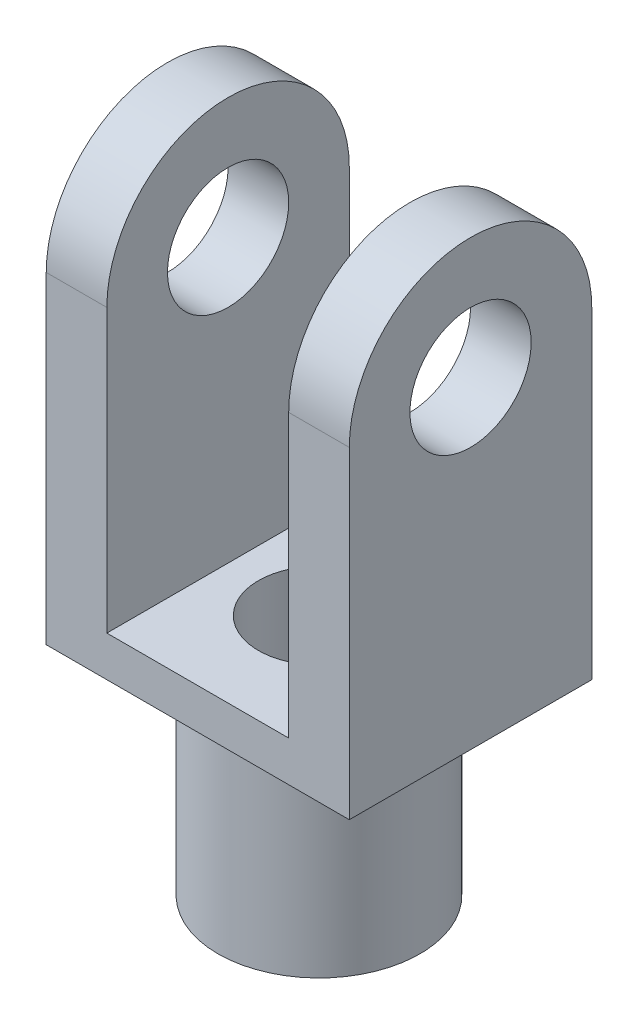
ISO-10303-21;
HEADER;
FILE_DESCRIPTION(('STEP AP214'),'2;1');
FILE_NAME('part.step','',(''),(''),'','','');
FILE_SCHEMA(('AUTOMOTIVE_DESIGN { 1 0 10303 214 1 1 1 1 }'));
ENDSEC;
DATA;
#1=APPLICATION_CONTEXT('core data for automotive mechanical design processes');
#2=APPLICATION_PROTOCOL_DEFINITION('international standard','automotive_design',2000,#1);
#3=PRODUCT_CONTEXT('',#1,'mechanical');
#4=PRODUCT('Part','Part','',(#3));
#5=PRODUCT_RELATED_PRODUCT_CATEGORY('part','',(#4));
#6=PRODUCT_DEFINITION_FORMATION('','',#4);
#7=PRODUCT_DEFINITION_CONTEXT('part definition',#1,'design');
#8=PRODUCT_DEFINITION('design','',#6,#7);
#9=PRODUCT_DEFINITION_SHAPE('','',#8);
#10=(LENGTH_UNIT() NAMED_UNIT(*) SI_UNIT(.MILLI.,.METRE.));
#11=(NAMED_UNIT(*) PLANE_ANGLE_UNIT() SI_UNIT($,.RADIAN.));
#12=(NAMED_UNIT(*) SI_UNIT($,.STERADIAN.) SOLID_ANGLE_UNIT());
#13=UNCERTAINTY_MEASURE_WITH_UNIT(LENGTH_MEASURE(1.E-05),#10,'distance_accuracy_value','');
#14=(GEOMETRIC_REPRESENTATION_CONTEXT(3) GLOBAL_UNCERTAINTY_ASSIGNED_CONTEXT((#13)) GLOBAL_UNIT_ASSIGNED_CONTEXT((#10,
#11,#12)) REPRESENTATION_CONTEXT('',''));
#15=CARTESIAN_POINT('',(0.,0.,0.));
#16=DIRECTION('',(0.,0.,1.));
#17=DIRECTION('',(1.,0.,0.));
#18=AXIS2_PLACEMENT_3D('',#15,#16,#17);
#19=CARTESIAN_POINT('',(7.5,12.,6.));
#20=DIRECTION('',(-1.,0.,0.));
#21=DIRECTION('',(0.,0.,1.));
#22=AXIS2_PLACEMENT_3D('',#19,#20,#21);
#23=PLANE('',#22);
#24=CARTESIAN_POINT('',(7.5,25.9578286914232,0.));
#25=DIRECTION('',(1.,0.,0.));
#26=DIRECTION('',(0.,0.,-1.));
#27=AXIS2_PLACEMENT_3D('',#24,#25,#26);
#28=CIRCLE('',#27,3.);
#29=CARTESIAN_POINT('',(7.5,25.9578286914232,-3.));
#30=VERTEX_POINT('',#29);
#31=EDGE_CURVE('E209',#30,#30,#28,.T.);
#32=ORIENTED_EDGE('',*,*,#31,.F.);
#33=EDGE_LOOP('',(#32));
#34=FACE_BOUND('',#33,.T.);
#35=CARTESIAN_POINT('',(7.5,25.9578286914232,0.));
#36=DIRECTION('',(-1.,0.,0.));
#37=DIRECTION('',(0.,0.,1.));
#38=AXIS2_PLACEMENT_3D('',#35,#36,#37);
#39=CIRCLE('',#38,6.);
#40=CARTESIAN_POINT('',(7.5,25.9578286914232,6.));
#41=VERTEX_POINT('',#40);
#42=CARTESIAN_POINT('',(7.5,25.9578286914232,-6.));
#43=VERTEX_POINT('',#42);
#44=EDGE_CURVE('E110',#41,#43,#39,.T.);
#45=ORIENTED_EDGE('',*,*,#44,.F.);
#46=DIRECTION('',(0.,-1.,0.));
#47=VECTOR('',#46,1.);
#48=CARTESIAN_POINT('',(7.5,12.,6.));
#49=LINE('',#48,#47);
#50=CARTESIAN_POINT('',(7.5,10.,6.));
#51=VERTEX_POINT('',#50);
#52=EDGE_CURVE('E119',#41,#51,#49,.T.);
#53=ORIENTED_EDGE('',*,*,#52,.T.);
#54=DIRECTION('',(0.,0.,-1.));
#55=VECTOR('',#54,1.);
#56=CARTESIAN_POINT('',(7.5,10.,6.));
#57=LINE('',#56,#55);
#58=CARTESIAN_POINT('',(7.5,10.,-6.));
#59=VERTEX_POINT('',#58);
#60=EDGE_CURVE('E242',#51,#59,#57,.T.);
#61=ORIENTED_EDGE('',*,*,#60,.T.);
#62=DIRECTION('',(0.,-1.,0.));
#63=VECTOR('',#62,1.);
#64=CARTESIAN_POINT('',(7.5,12.,-6.));
#65=LINE('',#64,#63);
#66=EDGE_CURVE('E121',#43,#59,#65,.T.);
#67=ORIENTED_EDGE('',*,*,#66,.F.);
#68=EDGE_LOOP('',(#45,#53,#61,#67));
#69=FACE_BOUND('',#68,.T.);
#70=ADVANCED_FACE('F41',(#34,#69),#23,.F.);
#71=CARTESIAN_POINT('',(-7.5,12.,6.));
#72=DIRECTION('',(1.,0.,0.));
#73=DIRECTION('',(0.,0.,-1.));
#74=AXIS2_PLACEMENT_3D('',#71,#72,#73);
#75=PLANE('',#74);
#76=CARTESIAN_POINT('',(-7.5,25.9578286914232,0.));
#77=DIRECTION('',(1.,0.,0.));
#78=DIRECTION('',(0.,0.,-1.));
#79=AXIS2_PLACEMENT_3D('',#76,#77,#78);
#80=CIRCLE('',#79,3.);
#81=CARTESIAN_POINT('',(-7.5,25.9578286914232,-3.));
#82=VERTEX_POINT('',#81);
#83=EDGE_CURVE('E210',#82,#82,#80,.T.);
#84=ORIENTED_EDGE('',*,*,#83,.T.);
#85=EDGE_LOOP('',(#84));
#86=FACE_BOUND('',#85,.T.);
#87=CARTESIAN_POINT('',(-7.5,25.9578286914232,0.));
#88=DIRECTION('',(-1.,0.,0.));
#89=DIRECTION('',(0.,0.,1.));
#90=AXIS2_PLACEMENT_3D('',#87,#88,#89);
#91=CIRCLE('',#90,6.);
#92=CARTESIAN_POINT('',(-7.5,25.9578286914232,6.));
#93=VERTEX_POINT('',#92);
#94=CARTESIAN_POINT('',(-7.5,25.9578286914232,-6.));
#95=VERTEX_POINT('',#94);
#96=EDGE_CURVE('E57',#93,#95,#91,.T.);
#97=ORIENTED_EDGE('',*,*,#96,.T.);
#98=DIRECTION('',(0.,-1.,0.));
#99=VECTOR('',#98,1.);
#100=CARTESIAN_POINT('',(-7.5,12.,-6.));
#101=LINE('',#100,#99);
#102=CARTESIAN_POINT('',(-7.5,10.,-6.));
#103=VERTEX_POINT('',#102);
#104=EDGE_CURVE('E130',#95,#103,#101,.T.);
#105=ORIENTED_EDGE('',*,*,#104,.T.);
#106=DIRECTION('',(0.,0.,1.));
#107=VECTOR('',#106,1.);
#108=CARTESIAN_POINT('',(-7.5,10.,6.));
#109=LINE('',#108,#107);
#110=CARTESIAN_POINT('',(-7.5,10.,6.));
#111=VERTEX_POINT('',#110);
#112=EDGE_CURVE('E250',#103,#111,#109,.T.);
#113=ORIENTED_EDGE('',*,*,#112,.T.);
#114=DIRECTION('',(0.,-1.,0.));
#115=VECTOR('',#114,1.);
#116=CARTESIAN_POINT('',(-7.5,12.,6.));
#117=LINE('',#116,#115);
#118=EDGE_CURVE('E127',#93,#111,#117,.T.);
#119=ORIENTED_EDGE('',*,*,#118,.F.);
#120=EDGE_LOOP('',(#97,#105,#113,#119));
#121=FACE_BOUND('',#120,.T.);
#122=ADVANCED_FACE('F163',(#86,#121),#75,.F.);
#123=CARTESIAN_POINT('',(-7.5,12.,6.));
#124=DIRECTION('',(0.,0.,-1.));
#125=DIRECTION('',(-1.,0.,0.));
#126=AXIS2_PLACEMENT_3D('',#123,#124,#125);
#127=PLANE('',#126);
#128=ORIENTED_EDGE('',*,*,#52,.F.);
#129=DIRECTION('',(-1.,0.,0.));
#130=VECTOR('',#129,1.);
#131=CARTESIAN_POINT('',(7.5,25.9578286914232,6.));
#132=LINE('',#131,#130);
#133=CARTESIAN_POINT('',(4.5,25.9578286914232,6.));
#134=VERTEX_POINT('',#133);
#135=EDGE_CURVE('E107',#41,#134,#132,.T.);
#136=ORIENTED_EDGE('',*,*,#135,.T.);
#137=DIRECTION('',(0.,-1.,0.));
#138=VECTOR('',#137,1.);
#139=CARTESIAN_POINT('',(4.5,32.,6.));
#140=LINE('',#139,#138);
#141=CARTESIAN_POINT('',(4.5,12.,6.));
#142=VERTEX_POINT('',#141);
#143=EDGE_CURVE('E229',#134,#142,#140,.T.);
#144=ORIENTED_EDGE('',*,*,#143,.T.);
#145=DIRECTION('',(1.,0.,0.));
#146=VECTOR('',#145,1.);
#147=CARTESIAN_POINT('',(-7.5,12.,6.));
#148=LINE('',#147,#146);
#149=CARTESIAN_POINT('',(-4.5,12.,6.));
#150=VERTEX_POINT('',#149);
#151=EDGE_CURVE('E128',#150,#142,#148,.T.);
#152=ORIENTED_EDGE('',*,*,#151,.F.);
#153=DIRECTION('',(0.,-1.,0.));
#154=VECTOR('',#153,1.);
#155=CARTESIAN_POINT('',(-4.5,32.,6.));
#156=LINE('',#155,#154);
#157=CARTESIAN_POINT('',(-4.5,25.9578286914232,6.));
#158=VERTEX_POINT('',#157);
#159=EDGE_CURVE('E236',#158,#150,#156,.T.);
#160=ORIENTED_EDGE('',*,*,#159,.F.);
#161=EDGE_CURVE('E65',#158,#93,#132,.T.);
#162=ORIENTED_EDGE('',*,*,#161,.T.);
#163=ORIENTED_EDGE('',*,*,#118,.T.);
#164=DIRECTION('',(1.,0.,0.));
#165=VECTOR('',#164,1.);
#166=CARTESIAN_POINT('',(-7.5,10.,6.));
#167=LINE('',#166,#165);
#168=EDGE_CURVE('E125',#111,#51,#167,.T.);
#169=ORIENTED_EDGE('',*,*,#168,.T.);
#170=EDGE_LOOP('',(#128,#136,#144,#152,#160,#162,#163,#169));
#171=FACE_BOUND('',#170,.T.);
#172=ADVANCED_FACE('F123',(#171),#127,.F.);
#173=CARTESIAN_POINT('',(-4.5,32.,0.));
#174=DIRECTION('',(-1.,0.,0.));
#175=DIRECTION('',(0.,0.,1.));
#176=AXIS2_PLACEMENT_3D('',#173,#174,#175);
#177=PLANE('',#176);
#178=CARTESIAN_POINT('',(-4.5,25.9578286914232,0.));
#179=DIRECTION('',(-1.,0.,0.));
#180=DIRECTION('',(0.,0.,1.));
#181=AXIS2_PLACEMENT_3D('',#178,#179,#180);
#182=CIRCLE('',#181,3.);
#183=CARTESIAN_POINT('',(-4.5,25.9578286914232,3.));
#184=VERTEX_POINT('',#183);
#185=EDGE_CURVE('E215',#184,#184,#182,.T.);
#186=ORIENTED_EDGE('',*,*,#185,.T.);
#187=EDGE_LOOP('',(#186));
#188=FACE_BOUND('',#187,.T.);
#189=CARTESIAN_POINT('',(-4.5,25.9578286914232,0.));
#190=DIRECTION('',(-1.,0.,0.));
#191=DIRECTION('',(0.,0.,1.));
#192=AXIS2_PLACEMENT_3D('',#189,#190,#191);
#193=CIRCLE('',#192,6.);
#194=CARTESIAN_POINT('',(-4.5,25.9578286914232,-6.));
#195=VERTEX_POINT('',#194);
#196=EDGE_CURVE('E220',#158,#195,#193,.T.);
#197=ORIENTED_EDGE('',*,*,#196,.F.);
#198=ORIENTED_EDGE('',*,*,#159,.T.);
#199=DIRECTION('',(0.,0.,-1.));
#200=VECTOR('',#199,1.);
#201=CARTESIAN_POINT('',(-4.5,12.,0.));
#202=LINE('',#201,#200);
#203=CARTESIAN_POINT('',(-4.5,12.,-6.));
#204=VERTEX_POINT('',#203);
#205=EDGE_CURVE('E231',#150,#204,#202,.T.);
#206=ORIENTED_EDGE('',*,*,#205,.T.);
#207=DIRECTION('',(0.,-1.,0.));
#208=VECTOR('',#207,1.);
#209=CARTESIAN_POINT('',(-4.5,32.,-6.));
#210=LINE('',#209,#208);
#211=EDGE_CURVE('E234',#195,#204,#210,.T.);
#212=ORIENTED_EDGE('',*,*,#211,.F.);
#213=EDGE_LOOP('',(#197,#198,#206,#212));
#214=FACE_BOUND('',#213,.T.);
#215=ADVANCED_FACE('F174',(#188,#214),#177,.F.);
#216=CARTESIAN_POINT('',(4.5,32.,0.));
#217=DIRECTION('',(-1.,0.,0.));
#218=DIRECTION('',(0.,0.,1.));
#219=AXIS2_PLACEMENT_3D('',#216,#217,#218);
#220=PLANE('',#219);
#221=CARTESIAN_POINT('',(4.5,25.9578286914232,0.));
#222=DIRECTION('',(-1.,0.,0.));
#223=DIRECTION('',(0.,0.,1.));
#224=AXIS2_PLACEMENT_3D('',#221,#222,#223);
#225=CIRCLE('',#224,3.);
#226=CARTESIAN_POINT('',(4.5,25.9578286914232,3.));
#227=VERTEX_POINT('',#226);
#228=EDGE_CURVE('E45',#227,#227,#225,.T.);
#229=ORIENTED_EDGE('',*,*,#228,.F.);
#230=EDGE_LOOP('',(#229));
#231=FACE_BOUND('',#230,.T.);
#232=ORIENTED_EDGE('',*,*,#143,.F.);
#233=CARTESIAN_POINT('',(4.5,25.9578286914232,0.));
#234=DIRECTION('',(-1.,0.,0.));
#235=DIRECTION('',(0.,0.,1.));
#236=AXIS2_PLACEMENT_3D('',#233,#234,#235);
#237=CIRCLE('',#236,6.);
#238=CARTESIAN_POINT('',(4.5,25.9578286914232,-6.));
#239=VERTEX_POINT('',#238);
#240=EDGE_CURVE('E11',#134,#239,#237,.T.);
#241=ORIENTED_EDGE('',*,*,#240,.T.);
#242=DIRECTION('',(0.,-1.,0.));
#243=VECTOR('',#242,1.);
#244=CARTESIAN_POINT('',(4.5,32.,-6.));
#245=LINE('',#244,#243);
#246=CARTESIAN_POINT('',(4.5,12.,-6.));
#247=VERTEX_POINT('',#246);
#248=EDGE_CURVE('E227',#239,#247,#245,.T.);
#249=ORIENTED_EDGE('',*,*,#248,.T.);
#250=DIRECTION('',(0.,0.,-1.));
#251=VECTOR('',#250,1.);
#252=CARTESIAN_POINT('',(4.5,12.,0.));
#253=LINE('',#252,#251);
#254=EDGE_CURVE('E224',#142,#247,#253,.T.);
#255=ORIENTED_EDGE('',*,*,#254,.F.);
#256=EDGE_LOOP('',(#232,#241,#249,#255));
#257=FACE_BOUND('',#256,.T.);
#258=ADVANCED_FACE('F181',(#231,#257),#220,.T.);
#259=CARTESIAN_POINT('',(0.,12.,0.));
#260=DIRECTION('',(0.,-1.,0.));
#261=DIRECTION('',(0.,0.,-1.));
#262=AXIS2_PLACEMENT_3D('',#259,#260,#261);
#263=PLANE('',#262);
#264=CARTESIAN_POINT('',(0.,12.,0.));
#265=DIRECTION('',(0.,-1.,0.));
#266=DIRECTION('',(0.,0.,-1.));
#267=AXIS2_PLACEMENT_3D('',#264,#265,#266);
#268=CIRCLE('',#267,3.);
#269=CARTESIAN_POINT('',(0.,12.,-3.));
#270=VERTEX_POINT('',#269);
#271=EDGE_CURVE('E239',#270,#270,#268,.T.);
#272=ORIENTED_EDGE('',*,*,#271,.T.);
#273=EDGE_LOOP('',(#272));
#274=FACE_BOUND('',#273,.T.);
#275=ORIENTED_EDGE('',*,*,#151,.T.);
#276=ORIENTED_EDGE('',*,*,#254,.T.);
#277=DIRECTION('',(-1.,0.,0.));
#278=VECTOR('',#277,1.);
#279=CARTESIAN_POINT('',(-7.5,12.,-6.));
#280=LINE('',#279,#278);
#281=EDGE_CURVE('E133',#247,#204,#280,.T.);
#282=ORIENTED_EDGE('',*,*,#281,.T.);
#283=ORIENTED_EDGE('',*,*,#205,.F.);
#284=EDGE_LOOP('',(#275,#276,#282,#283));
#285=FACE_BOUND('',#284,.T.);
#286=ADVANCED_FACE('F158',(#274,#285),#263,.F.);
#287=CARTESIAN_POINT('',(0.,10.,0.));
#288=DIRECTION('',(0.,-1.,0.));
#289=DIRECTION('',(0.,0.,-1.));
#290=AXIS2_PLACEMENT_3D('',#287,#288,#289);
#291=CYLINDRICAL_SURFACE('',#290,5.);
#292=CARTESIAN_POINT('',(0.,10.,0.));
#293=DIRECTION('',(0.,1.,0.));
#294=DIRECTION('',(0.,0.,1.));
#295=AXIS2_PLACEMENT_3D('',#292,#293,#294);
#296=CIRCLE('',#295,5.);
#297=CARTESIAN_POINT('',(0.,10.,5.));
#298=VERTEX_POINT('',#297);
#299=EDGE_CURVE('E50',#298,#298,#296,.T.);
#300=ORIENTED_EDGE('',*,*,#299,.F.);
#301=EDGE_LOOP('',(#300));
#302=FACE_BOUND('',#301,.T.);
#303=CARTESIAN_POINT('',(0.,0.,0.));
#304=DIRECTION('',(0.,1.,0.));
#305=DIRECTION('',(0.,0.,1.));
#306=AXIS2_PLACEMENT_3D('',#303,#304,#305);
#307=CIRCLE('',#306,5.);
#308=CARTESIAN_POINT('',(0.,0.,5.));
#309=VERTEX_POINT('',#308);
#310=EDGE_CURVE('E140',#309,#309,#307,.T.);
#311=ORIENTED_EDGE('',*,*,#310,.T.);
#312=EDGE_LOOP('',(#311));
#313=FACE_BOUND('',#312,.T.);
#314=ADVANCED_FACE('F43',(#302,#313),#291,.T.);
#315=CARTESIAN_POINT('',(0.,0.,0.));
#316=DIRECTION('',(0.,1.,0.));
#317=DIRECTION('',(0.,0.,1.));
#318=AXIS2_PLACEMENT_3D('',#315,#316,#317);
#319=PLANE('',#318);
#320=CARTESIAN_POINT('',(0.,0.,0.));
#321=DIRECTION('',(0.,-1.,0.));
#322=DIRECTION('',(0.,0.,-1.));
#323=AXIS2_PLACEMENT_3D('',#320,#321,#322);
#324=CIRCLE('',#323,3.);
#325=CARTESIAN_POINT('',(0.,0.,-3.));
#326=VERTEX_POINT('',#325);
#327=EDGE_CURVE('E238',#326,#326,#324,.T.);
#328=ORIENTED_EDGE('',*,*,#327,.F.);
#329=EDGE_LOOP('',(#328));
#330=FACE_BOUND('',#329,.T.);
#331=ORIENTED_EDGE('',*,*,#310,.F.);
#332=EDGE_LOOP('',(#331));
#333=FACE_BOUND('',#332,.T.);
#334=ADVANCED_FACE('F147',(#330,#333),#319,.F.);
#335=CARTESIAN_POINT('',(-7.5,12.,-6.));
#336=DIRECTION('',(0.,0.,1.));
#337=DIRECTION('',(1.,0.,0.));
#338=AXIS2_PLACEMENT_3D('',#335,#336,#337);
#339=PLANE('',#338);
#340=DIRECTION('',(-1.,0.,0.));
#341=VECTOR('',#340,1.);
#342=CARTESIAN_POINT('',(7.5,25.9578286914232,-6.));
#343=LINE('',#342,#341);
#344=EDGE_CURVE('E219',#43,#239,#343,.T.);
#345=ORIENTED_EDGE('',*,*,#344,.F.);
#346=ORIENTED_EDGE('',*,*,#66,.T.);
#347=DIRECTION('',(-1.,0.,0.));
#348=VECTOR('',#347,1.);
#349=CARTESIAN_POINT('',(-7.5,10.,-6.));
#350=LINE('',#349,#348);
#351=EDGE_CURVE('E248',#59,#103,#350,.T.);
#352=ORIENTED_EDGE('',*,*,#351,.T.);
#353=ORIENTED_EDGE('',*,*,#104,.F.);
#354=EDGE_CURVE('E114',#195,#95,#343,.T.);
#355=ORIENTED_EDGE('',*,*,#354,.F.);
#356=ORIENTED_EDGE('',*,*,#211,.T.);
#357=ORIENTED_EDGE('',*,*,#281,.F.);
#358=ORIENTED_EDGE('',*,*,#248,.F.);
#359=EDGE_LOOP('',(#345,#346,#352,#353,#355,#356,#357,#358));
#360=FACE_BOUND('',#359,.T.);
#361=ADVANCED_FACE('F149',(#360),#339,.F.);
#362=CARTESIAN_POINT('',(0.,10.,0.));
#363=DIRECTION('',(0.,-1.,0.));
#364=DIRECTION('',(0.,0.,-1.));
#365=AXIS2_PLACEMENT_3D('',#362,#363,#364);
#366=PLANE('',#365);
#367=ORIENTED_EDGE('',*,*,#299,.T.);
#368=EDGE_LOOP('',(#367));
#369=FACE_BOUND('',#368,.T.);
#370=ORIENTED_EDGE('',*,*,#60,.F.);
#371=ORIENTED_EDGE('',*,*,#168,.F.);
#372=ORIENTED_EDGE('',*,*,#112,.F.);
#373=ORIENTED_EDGE('',*,*,#351,.F.);
#374=EDGE_LOOP('',(#370,#371,#372,#373));
#375=FACE_BOUND('',#374,.T.);
#376=ADVANCED_FACE('F155',(#369,#375),#366,.T.);
#377=CARTESIAN_POINT('',(0.,12.,0.));
#378=DIRECTION('',(0.,-1.,0.));
#379=DIRECTION('',(0.,0.,-1.));
#380=AXIS2_PLACEMENT_3D('',#377,#378,#379);
#381=CYLINDRICAL_SURFACE('',#380,3.);
#382=ORIENTED_EDGE('',*,*,#271,.F.);
#383=EDGE_LOOP('',(#382));
#384=FACE_BOUND('',#383,.T.);
#385=ORIENTED_EDGE('',*,*,#327,.T.);
#386=EDGE_LOOP('',(#385));
#387=FACE_BOUND('',#386,.T.);
#388=ADVANCED_FACE('F177',(#384,#387),#381,.F.);
#389=CARTESIAN_POINT('',(7.5,25.9578286914232,0.));
#390=DIRECTION('',(-1.,0.,0.));
#391=DIRECTION('',(0.,0.,1.));
#392=AXIS2_PLACEMENT_3D('',#389,#390,#391);
#393=CYLINDRICAL_SURFACE('',#392,6.);
#394=ORIENTED_EDGE('',*,*,#240,.F.);
#395=ORIENTED_EDGE('',*,*,#135,.F.);
#396=ORIENTED_EDGE('',*,*,#44,.T.);
#397=ORIENTED_EDGE('',*,*,#344,.T.);
#398=EDGE_LOOP('',(#394,#395,#396,#397));
#399=FACE_BOUND('',#398,.T.);
#400=ADVANCED_FACE('F109',(#399),#393,.T.);
#401=ORIENTED_EDGE('',*,*,#161,.F.);
#402=ORIENTED_EDGE('',*,*,#196,.T.);
#403=ORIENTED_EDGE('',*,*,#354,.T.);
#404=ORIENTED_EDGE('',*,*,#96,.F.);
#405=EDGE_LOOP('',(#401,#402,#403,#404));
#406=FACE_BOUND('',#405,.T.);
#407=ADVANCED_FACE('F194',(#406),#393,.T.);
#408=CARTESIAN_POINT('',(-7.5,25.9578286914232,0.));
#409=DIRECTION('',(1.,0.,0.));
#410=DIRECTION('',(0.,0.,-1.));
#411=AXIS2_PLACEMENT_3D('',#408,#409,#410);
#412=CYLINDRICAL_SURFACE('',#411,3.);
#413=ORIENTED_EDGE('',*,*,#228,.T.);
#414=EDGE_LOOP('',(#413));
#415=FACE_BOUND('',#414,.T.);
#416=ORIENTED_EDGE('',*,*,#31,.T.);
#417=EDGE_LOOP('',(#416));
#418=FACE_BOUND('',#417,.T.);
#419=ADVANCED_FACE('F195',(#415,#418),#412,.F.);
#420=ORIENTED_EDGE('',*,*,#83,.F.);
#421=EDGE_LOOP('',(#420));
#422=FACE_BOUND('',#421,.T.);
#423=ORIENTED_EDGE('',*,*,#185,.F.);
#424=EDGE_LOOP('',(#423));
#425=FACE_BOUND('',#424,.T.);
#426=ADVANCED_FACE('F197',(#422,#425),#412,.F.);
#427=CLOSED_SHELL('',(#70,#122,#172,#215,#258,#286,#314,#334,#361,#376,#388,#400,#407,#419,#426));
#428=MANIFOLD_SOLID_BREP('B2',#427);
#429=ADVANCED_BREP_SHAPE_REPRESENTATION('',(#18,#428),#14);
#430=SHAPE_DEFINITION_REPRESENTATION(#9,#429);
ENDSEC;
END-ISO-10303-21;
